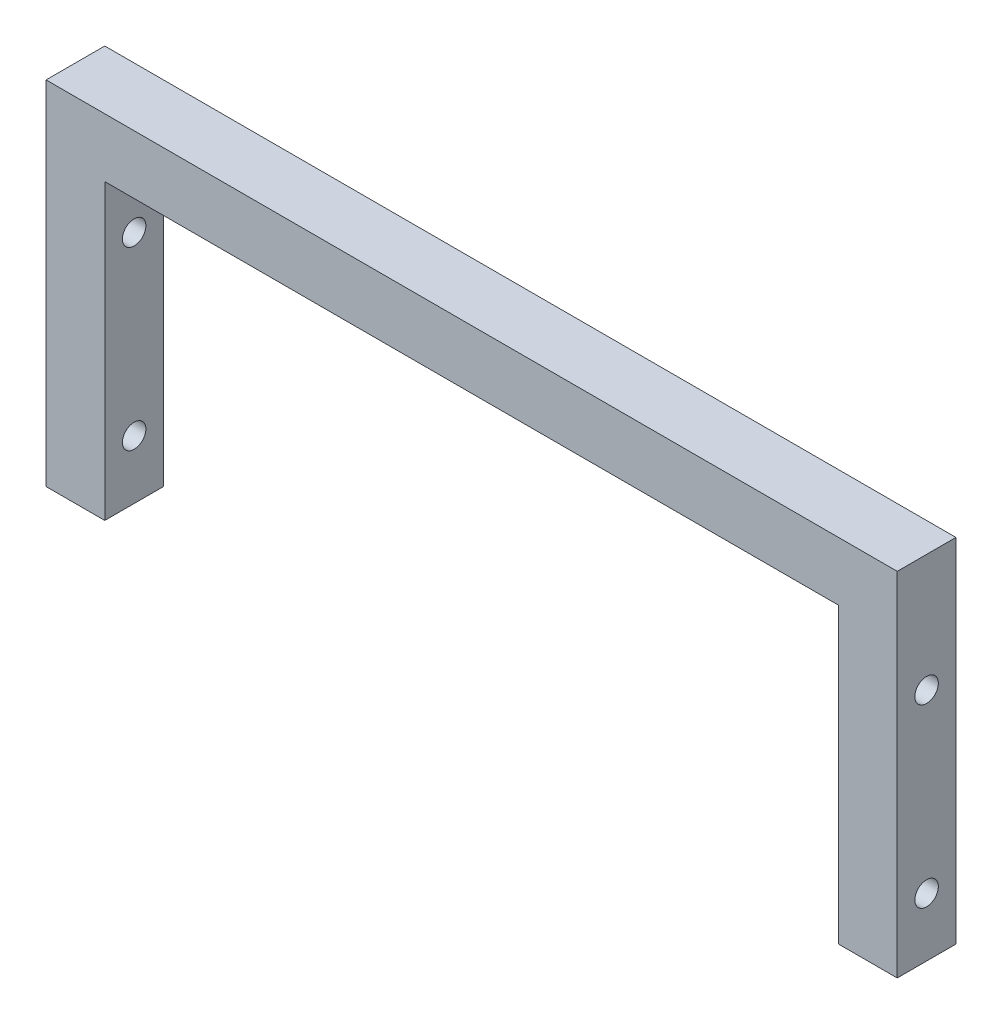
ISO-10303-21;
HEADER;
FILE_DESCRIPTION(('STEP AP214'),'2;1');
FILE_NAME('part.step','',(''),(''),'','','');
FILE_SCHEMA(('AUTOMOTIVE_DESIGN { 1 0 10303 214 1 1 1 1 }'));
ENDSEC;
DATA;
#1=APPLICATION_CONTEXT('core data for automotive mechanical design processes');
#2=APPLICATION_PROTOCOL_DEFINITION('international standard','automotive_design',2000,#1);
#3=PRODUCT_CONTEXT('',#1,'mechanical');
#4=PRODUCT('Part','Part','',(#3));
#5=PRODUCT_RELATED_PRODUCT_CATEGORY('part','',(#4));
#6=PRODUCT_DEFINITION_FORMATION('','',#4);
#7=PRODUCT_DEFINITION_CONTEXT('part definition',#1,'design');
#8=PRODUCT_DEFINITION('design','',#6,#7);
#9=PRODUCT_DEFINITION_SHAPE('','',#8);
#10=(LENGTH_UNIT() NAMED_UNIT(*) SI_UNIT(.MILLI.,.METRE.));
#11=(NAMED_UNIT(*) PLANE_ANGLE_UNIT() SI_UNIT($,.RADIAN.));
#12=(NAMED_UNIT(*) SI_UNIT($,.STERADIAN.) SOLID_ANGLE_UNIT());
#13=UNCERTAINTY_MEASURE_WITH_UNIT(LENGTH_MEASURE(1.E-05),#10,'distance_accuracy_value','');
#14=(GEOMETRIC_REPRESENTATION_CONTEXT(3) GLOBAL_UNCERTAINTY_ASSIGNED_CONTEXT((#13)) GLOBAL_UNIT_ASSIGNED_CONTEXT((#10,
#11,#12)) REPRESENTATION_CONTEXT('',''));
#15=CARTESIAN_POINT('',(0.,0.,0.));
#16=DIRECTION('',(0.,0.,1.));
#17=DIRECTION('',(1.,0.,0.));
#18=AXIS2_PLACEMENT_3D('',#15,#16,#17);
#19=CARTESIAN_POINT('',(10.,0.,10.));
#20=DIRECTION('',(0.,1.,0.));
#21=DIRECTION('',(-1.,0.,0.));
#22=AXIS2_PLACEMENT_3D('',#19,#20,#21);
#23=PLANE('',#22);
#24=DIRECTION('',(1.,0.,0.));
#25=VECTOR('',#24,1.);
#26=CARTESIAN_POINT('',(10.,0.,0.));
#27=LINE('',#26,#25);
#28=CARTESIAN_POINT('',(0.,0.,0.));
#29=VERTEX_POINT('',#28);
#30=CARTESIAN_POINT('',(10.,0.,0.));
#31=VERTEX_POINT('',#30);
#32=EDGE_CURVE('E133',#29,#31,#27,.T.);
#33=ORIENTED_EDGE('',*,*,#32,.T.);
#34=DIRECTION('',(0.,0.,-1.));
#35=VECTOR('',#34,1.);
#36=CARTESIAN_POINT('',(10.,0.,10.));
#37=LINE('',#36,#35);
#38=CARTESIAN_POINT('',(10.,0.,10.));
#39=VERTEX_POINT('',#38);
#40=EDGE_CURVE('E11',#39,#31,#37,.T.);
#41=ORIENTED_EDGE('',*,*,#40,.F.);
#42=DIRECTION('',(1.,0.,0.));
#43=VECTOR('',#42,1.);
#44=CARTESIAN_POINT('',(10.,0.,10.));
#45=LINE('',#44,#43);
#46=CARTESIAN_POINT('',(0.,0.,10.));
#47=VERTEX_POINT('',#46);
#48=EDGE_CURVE('E148',#47,#39,#45,.T.);
#49=ORIENTED_EDGE('',*,*,#48,.F.);
#50=DIRECTION('',(0.,0.,-1.));
#51=VECTOR('',#50,1.);
#52=CARTESIAN_POINT('',(0.,0.,10.));
#53=LINE('',#52,#51);
#54=EDGE_CURVE('E129',#47,#29,#53,.T.);
#55=ORIENTED_EDGE('',*,*,#54,.T.);
#56=EDGE_LOOP('',(#33,#41,#49,#55));
#57=FACE_BOUND('',#56,.T.);
#58=ADVANCED_FACE('F37',(#57),#23,.F.);
#59=CARTESIAN_POINT('',(10.,50.,10.));
#60=DIRECTION('',(-1.,0.,0.));
#61=DIRECTION('',(0.,-1.,0.));
#62=AXIS2_PLACEMENT_3D('',#59,#60,#61);
#63=PLANE('',#62);
#64=CARTESIAN_POINT('',(10.,10.,5.));
#65=DIRECTION('',(-1.,0.,0.));
#66=DIRECTION('',(0.,-1.,0.));
#67=AXIS2_PLACEMENT_3D('',#64,#65,#66);
#68=CIRCLE('',#67,2.);
#69=CARTESIAN_POINT('',(10.,8.,5.));
#70=VERTEX_POINT('',#69);
#71=EDGE_CURVE('E137',#70,#70,#68,.T.);
#72=ORIENTED_EDGE('',*,*,#71,.T.);
#73=EDGE_LOOP('',(#72));
#74=FACE_BOUND('',#73,.T.);
#75=CARTESIAN_POINT('',(10.,40.,5.));
#76=DIRECTION('',(-1.,0.,0.));
#77=DIRECTION('',(0.,-1.,0.));
#78=AXIS2_PLACEMENT_3D('',#75,#76,#77);
#79=CIRCLE('',#78,2.);
#80=CARTESIAN_POINT('',(10.,38.,5.));
#81=VERTEX_POINT('',#80);
#82=EDGE_CURVE('E189',#81,#81,#79,.T.);
#83=ORIENTED_EDGE('',*,*,#82,.T.);
#84=EDGE_LOOP('',(#83));
#85=FACE_BOUND('',#84,.T.);
#86=DIRECTION('',(0.,1.,0.));
#87=VECTOR('',#86,1.);
#88=CARTESIAN_POINT('',(10.,50.,0.));
#89=LINE('',#88,#87);
#90=CARTESIAN_POINT('',(10.,50.,0.));
#91=VERTEX_POINT('',#90);
#92=EDGE_CURVE('E136',#31,#91,#89,.T.);
#93=ORIENTED_EDGE('',*,*,#92,.T.);
#94=DIRECTION('',(0.,0.,-1.));
#95=VECTOR('',#94,1.);
#96=CARTESIAN_POINT('',(10.,50.,10.));
#97=LINE('',#96,#95);
#98=CARTESIAN_POINT('',(10.,50.,10.));
#99=VERTEX_POINT('',#98);
#100=EDGE_CURVE('E45',#99,#91,#97,.T.);
#101=ORIENTED_EDGE('',*,*,#100,.F.);
#102=DIRECTION('',(0.,1.,0.));
#103=VECTOR('',#102,1.);
#104=CARTESIAN_POINT('',(10.,50.,10.));
#105=LINE('',#104,#103);
#106=EDGE_CURVE('E96',#39,#99,#105,.T.);
#107=ORIENTED_EDGE('',*,*,#106,.F.);
#108=ORIENTED_EDGE('',*,*,#40,.T.);
#109=EDGE_LOOP('',(#93,#101,#107,#108));
#110=FACE_BOUND('',#109,.T.);
#111=ADVANCED_FACE('F217',(#74,#85,#110),#63,.F.);
#112=CARTESIAN_POINT('',(135.,50.,10.));
#113=DIRECTION('',(0.,1.,0.));
#114=DIRECTION('',(-1.,0.,0.));
#115=AXIS2_PLACEMENT_3D('',#112,#113,#114);
#116=PLANE('',#115);
#117=DIRECTION('',(1.,0.,0.));
#118=VECTOR('',#117,1.);
#119=CARTESIAN_POINT('',(135.,50.,0.));
#120=LINE('',#119,#118);
#121=CARTESIAN_POINT('',(135.,50.,0.));
#122=VERTEX_POINT('',#121);
#123=EDGE_CURVE('E139',#91,#122,#120,.T.);
#124=ORIENTED_EDGE('',*,*,#123,.T.);
#125=DIRECTION('',(0.,0.,-1.));
#126=VECTOR('',#125,1.);
#127=CARTESIAN_POINT('',(135.,50.,10.));
#128=LINE('',#127,#126);
#129=CARTESIAN_POINT('',(135.,50.,10.));
#130=VERTEX_POINT('',#129);
#131=EDGE_CURVE('E155',#130,#122,#128,.T.);
#132=ORIENTED_EDGE('',*,*,#131,.F.);
#133=DIRECTION('',(1.,0.,0.));
#134=VECTOR('',#133,1.);
#135=CARTESIAN_POINT('',(135.,50.,10.));
#136=LINE('',#135,#134);
#137=EDGE_CURVE('E163',#99,#130,#136,.T.);
#138=ORIENTED_EDGE('',*,*,#137,.F.);
#139=ORIENTED_EDGE('',*,*,#100,.T.);
#140=EDGE_LOOP('',(#124,#132,#138,#139));
#141=FACE_BOUND('',#140,.T.);
#142=ADVANCED_FACE('F161',(#141),#116,.F.);
#143=CARTESIAN_POINT('',(135.,0.,10.));
#144=DIRECTION('',(1.,0.,0.));
#145=DIRECTION('',(0.,0.,-1.));
#146=AXIS2_PLACEMENT_3D('',#143,#144,#145);
#147=PLANE('',#146);
#148=CARTESIAN_POINT('',(135.,10.,5.));
#149=DIRECTION('',(1.,0.,0.));
#150=DIRECTION('',(0.,0.,-1.));
#151=AXIS2_PLACEMENT_3D('',#148,#149,#150);
#152=CIRCLE('',#151,2.);
#153=CARTESIAN_POINT('',(135.,10.,3.));
#154=VERTEX_POINT('',#153);
#155=EDGE_CURVE('E183',#154,#154,#152,.T.);
#156=ORIENTED_EDGE('',*,*,#155,.T.);
#157=EDGE_LOOP('',(#156));
#158=FACE_BOUND('',#157,.T.);
#159=CARTESIAN_POINT('',(135.,40.,5.));
#160=DIRECTION('',(1.,0.,0.));
#161=DIRECTION('',(0.,0.,-1.));
#162=AXIS2_PLACEMENT_3D('',#159,#160,#161);
#163=CIRCLE('',#162,2.);
#164=CARTESIAN_POINT('',(135.,40.,3.));
#165=VERTEX_POINT('',#164);
#166=EDGE_CURVE('E192',#165,#165,#163,.T.);
#167=ORIENTED_EDGE('',*,*,#166,.T.);
#168=EDGE_LOOP('',(#167));
#169=FACE_BOUND('',#168,.T.);
#170=DIRECTION('',(0.,-1.,0.));
#171=VECTOR('',#170,1.);
#172=CARTESIAN_POINT('',(135.,0.,0.));
#173=LINE('',#172,#171);
#174=CARTESIAN_POINT('',(135.,0.,0.));
#175=VERTEX_POINT('',#174);
#176=EDGE_CURVE('E141',#122,#175,#173,.T.);
#177=ORIENTED_EDGE('',*,*,#176,.T.);
#178=DIRECTION('',(0.,0.,-1.));
#179=VECTOR('',#178,1.);
#180=CARTESIAN_POINT('',(135.,0.,10.));
#181=LINE('',#180,#179);
#182=CARTESIAN_POINT('',(135.,0.,10.));
#183=VERTEX_POINT('',#182);
#184=EDGE_CURVE('E152',#183,#175,#181,.T.);
#185=ORIENTED_EDGE('',*,*,#184,.F.);
#186=DIRECTION('',(0.,-1.,0.));
#187=VECTOR('',#186,1.);
#188=CARTESIAN_POINT('',(135.,0.,10.));
#189=LINE('',#188,#187);
#190=EDGE_CURVE('E175',#130,#183,#189,.T.);
#191=ORIENTED_EDGE('',*,*,#190,.F.);
#192=ORIENTED_EDGE('',*,*,#131,.T.);
#193=EDGE_LOOP('',(#177,#185,#191,#192));
#194=FACE_BOUND('',#193,.T.);
#195=ADVANCED_FACE('F171',(#158,#169,#194),#147,.F.);
#196=CARTESIAN_POINT('',(145.,0.,10.));
#197=DIRECTION('',(0.,1.,0.));
#198=DIRECTION('',(-1.,0.,0.));
#199=AXIS2_PLACEMENT_3D('',#196,#197,#198);
#200=PLANE('',#199);
#201=DIRECTION('',(1.,0.,0.));
#202=VECTOR('',#201,1.);
#203=CARTESIAN_POINT('',(145.,0.,0.));
#204=LINE('',#203,#202);
#205=CARTESIAN_POINT('',(145.,0.,0.));
#206=VERTEX_POINT('',#205);
#207=EDGE_CURVE('E143',#175,#206,#204,.T.);
#208=ORIENTED_EDGE('',*,*,#207,.T.);
#209=DIRECTION('',(0.,0.,-1.));
#210=VECTOR('',#209,1.);
#211=CARTESIAN_POINT('',(145.,0.,10.));
#212=LINE('',#211,#210);
#213=CARTESIAN_POINT('',(145.,0.,10.));
#214=VERTEX_POINT('',#213);
#215=EDGE_CURVE('E124',#214,#206,#212,.T.);
#216=ORIENTED_EDGE('',*,*,#215,.F.);
#217=DIRECTION('',(1.,0.,0.));
#218=VECTOR('',#217,1.);
#219=CARTESIAN_POINT('',(145.,0.,10.));
#220=LINE('',#219,#218);
#221=EDGE_CURVE('E115',#183,#214,#220,.T.);
#222=ORIENTED_EDGE('',*,*,#221,.F.);
#223=ORIENTED_EDGE('',*,*,#184,.T.);
#224=EDGE_LOOP('',(#208,#216,#222,#223));
#225=FACE_BOUND('',#224,.T.);
#226=ADVANCED_FACE('F174',(#225),#200,.F.);
#227=CARTESIAN_POINT('',(145.,60.,10.));
#228=DIRECTION('',(-1.,0.,0.));
#229=DIRECTION('',(0.,0.,1.));
#230=AXIS2_PLACEMENT_3D('',#227,#228,#229);
#231=PLANE('',#230);
#232=CARTESIAN_POINT('',(145.,10.,5.));
#233=DIRECTION('',(-1.,0.,0.));
#234=DIRECTION('',(0.,0.,1.));
#235=AXIS2_PLACEMENT_3D('',#232,#233,#234);
#236=CIRCLE('',#235,2.);
#237=CARTESIAN_POINT('',(145.,10.,7.));
#238=VERTEX_POINT('',#237);
#239=EDGE_CURVE('E186',#238,#238,#236,.T.);
#240=ORIENTED_EDGE('',*,*,#239,.T.);
#241=EDGE_LOOP('',(#240));
#242=FACE_BOUND('',#241,.T.);
#243=CARTESIAN_POINT('',(145.,40.,5.));
#244=DIRECTION('',(-1.,0.,0.));
#245=DIRECTION('',(0.,0.,1.));
#246=AXIS2_PLACEMENT_3D('',#243,#244,#245);
#247=CIRCLE('',#246,2.);
#248=CARTESIAN_POINT('',(145.,40.,7.));
#249=VERTEX_POINT('',#248);
#250=EDGE_CURVE('E195',#249,#249,#247,.T.);
#251=ORIENTED_EDGE('',*,*,#250,.T.);
#252=EDGE_LOOP('',(#251));
#253=FACE_BOUND('',#252,.T.);
#254=DIRECTION('',(0.,1.,0.));
#255=VECTOR('',#254,1.);
#256=CARTESIAN_POINT('',(145.,60.,0.));
#257=LINE('',#256,#255);
#258=CARTESIAN_POINT('',(145.,60.,0.));
#259=VERTEX_POINT('',#258);
#260=EDGE_CURVE('E123',#206,#259,#257,.T.);
#261=ORIENTED_EDGE('',*,*,#260,.T.);
#262=DIRECTION('',(0.,0.,-1.));
#263=VECTOR('',#262,1.);
#264=CARTESIAN_POINT('',(145.,60.,10.));
#265=LINE('',#264,#263);
#266=CARTESIAN_POINT('',(145.,60.,10.));
#267=VERTEX_POINT('',#266);
#268=EDGE_CURVE('E120',#267,#259,#265,.T.);
#269=ORIENTED_EDGE('',*,*,#268,.F.);
#270=DIRECTION('',(0.,1.,0.));
#271=VECTOR('',#270,1.);
#272=CARTESIAN_POINT('',(145.,60.,10.));
#273=LINE('',#272,#271);
#274=EDGE_CURVE('E109',#214,#267,#273,.T.);
#275=ORIENTED_EDGE('',*,*,#274,.F.);
#276=ORIENTED_EDGE('',*,*,#215,.T.);
#277=EDGE_LOOP('',(#261,#269,#275,#276));
#278=FACE_BOUND('',#277,.T.);
#279=ADVANCED_FACE('F121',(#242,#253,#278),#231,.F.);
#280=CARTESIAN_POINT('',(0.,60.,10.));
#281=DIRECTION('',(0.,-1.,0.));
#282=DIRECTION('',(0.,0.,-1.));
#283=AXIS2_PLACEMENT_3D('',#280,#281,#282);
#284=PLANE('',#283);
#285=DIRECTION('',(-1.,0.,0.));
#286=VECTOR('',#285,1.);
#287=CARTESIAN_POINT('',(0.,60.,0.));
#288=LINE('',#287,#286);
#289=CARTESIAN_POINT('',(0.,60.,0.));
#290=VERTEX_POINT('',#289);
#291=EDGE_CURVE('E82',#259,#290,#288,.T.);
#292=ORIENTED_EDGE('',*,*,#291,.T.);
#293=DIRECTION('',(0.,0.,-1.));
#294=VECTOR('',#293,1.);
#295=CARTESIAN_POINT('',(0.,60.,10.));
#296=LINE('',#295,#294);
#297=CARTESIAN_POINT('',(0.,60.,10.));
#298=VERTEX_POINT('',#297);
#299=EDGE_CURVE('E125',#298,#290,#296,.T.);
#300=ORIENTED_EDGE('',*,*,#299,.F.);
#301=DIRECTION('',(-1.,0.,0.));
#302=VECTOR('',#301,1.);
#303=CARTESIAN_POINT('',(0.,60.,10.));
#304=LINE('',#303,#302);
#305=EDGE_CURVE('E113',#267,#298,#304,.T.);
#306=ORIENTED_EDGE('',*,*,#305,.F.);
#307=ORIENTED_EDGE('',*,*,#268,.T.);
#308=EDGE_LOOP('',(#292,#300,#306,#307));
#309=FACE_BOUND('',#308,.T.);
#310=ADVANCED_FACE('F127',(#309),#284,.F.);
#311=CARTESIAN_POINT('',(0.,0.,10.));
#312=DIRECTION('',(1.,0.,0.));
#313=DIRECTION('',(0.,0.,-1.));
#314=AXIS2_PLACEMENT_3D('',#311,#312,#313);
#315=PLANE('',#314);
#316=CARTESIAN_POINT('',(0.,10.,5.));
#317=DIRECTION('',(1.,0.,0.));
#318=DIRECTION('',(0.,0.,-1.));
#319=AXIS2_PLACEMENT_3D('',#316,#317,#318);
#320=CIRCLE('',#319,2.);
#321=CARTESIAN_POINT('',(0.,10.,3.));
#322=VERTEX_POINT('',#321);
#323=EDGE_CURVE('E198',#322,#322,#320,.T.);
#324=ORIENTED_EDGE('',*,*,#323,.T.);
#325=EDGE_LOOP('',(#324));
#326=FACE_BOUND('',#325,.T.);
#327=CARTESIAN_POINT('',(0.,40.,5.));
#328=DIRECTION('',(1.,0.,0.));
#329=DIRECTION('',(0.,0.,-1.));
#330=AXIS2_PLACEMENT_3D('',#327,#328,#329);
#331=CIRCLE('',#330,2.);
#332=CARTESIAN_POINT('',(0.,40.,3.));
#333=VERTEX_POINT('',#332);
#334=EDGE_CURVE('E199',#333,#333,#331,.T.);
#335=ORIENTED_EDGE('',*,*,#334,.T.);
#336=EDGE_LOOP('',(#335));
#337=FACE_BOUND('',#336,.T.);
#338=DIRECTION('',(0.,-1.,0.));
#339=VECTOR('',#338,1.);
#340=CARTESIAN_POINT('',(0.,0.,0.));
#341=LINE('',#340,#339);
#342=EDGE_CURVE('E88',#290,#29,#341,.T.);
#343=ORIENTED_EDGE('',*,*,#342,.T.);
#344=ORIENTED_EDGE('',*,*,#54,.F.);
#345=DIRECTION('',(0.,-1.,0.));
#346=VECTOR('',#345,1.);
#347=CARTESIAN_POINT('',(0.,0.,10.));
#348=LINE('',#347,#346);
#349=EDGE_CURVE('E53',#298,#47,#348,.T.);
#350=ORIENTED_EDGE('',*,*,#349,.F.);
#351=ORIENTED_EDGE('',*,*,#299,.T.);
#352=EDGE_LOOP('',(#343,#344,#350,#351));
#353=FACE_BOUND('',#352,.T.);
#354=ADVANCED_FACE('F205',(#326,#337,#353),#315,.F.);
#355=CARTESIAN_POINT('',(0.,0.,10.));
#356=DIRECTION('',(0.,0.,-1.));
#357=DIRECTION('',(-1.,0.,0.));
#358=AXIS2_PLACEMENT_3D('',#355,#356,#357);
#359=PLANE('',#358);
#360=ORIENTED_EDGE('',*,*,#48,.T.);
#361=ORIENTED_EDGE('',*,*,#106,.T.);
#362=ORIENTED_EDGE('',*,*,#137,.T.);
#363=ORIENTED_EDGE('',*,*,#190,.T.);
#364=ORIENTED_EDGE('',*,*,#221,.T.);
#365=ORIENTED_EDGE('',*,*,#274,.T.);
#366=ORIENTED_EDGE('',*,*,#305,.T.);
#367=ORIENTED_EDGE('',*,*,#349,.T.);
#368=EDGE_LOOP('',(#360,#361,#362,#363,#364,#365,#366,#367));
#369=FACE_BOUND('',#368,.T.);
#370=ADVANCED_FACE('F111',(#369),#359,.F.);
#371=CARTESIAN_POINT('',(0.,0.,0.));
#372=DIRECTION('',(0.,0.,-1.));
#373=DIRECTION('',(-1.,0.,0.));
#374=AXIS2_PLACEMENT_3D('',#371,#372,#373);
#375=PLANE('',#374);
#376=ORIENTED_EDGE('',*,*,#32,.F.);
#377=ORIENTED_EDGE('',*,*,#342,.F.);
#378=ORIENTED_EDGE('',*,*,#291,.F.);
#379=ORIENTED_EDGE('',*,*,#260,.F.);
#380=ORIENTED_EDGE('',*,*,#207,.F.);
#381=ORIENTED_EDGE('',*,*,#176,.F.);
#382=ORIENTED_EDGE('',*,*,#123,.F.);
#383=ORIENTED_EDGE('',*,*,#92,.F.);
#384=EDGE_LOOP('',(#376,#377,#378,#379,#380,#381,#382,#383));
#385=FACE_BOUND('',#384,.T.);
#386=ADVANCED_FACE('F167',(#385),#375,.T.);
#387=CARTESIAN_POINT('',(0.,40.,5.));
#388=DIRECTION('',(1.,0.,0.));
#389=DIRECTION('',(0.,0.,-1.));
#390=AXIS2_PLACEMENT_3D('',#387,#388,#389);
#391=CYLINDRICAL_SURFACE('',#390,2.);
#392=ORIENTED_EDGE('',*,*,#334,.F.);
#393=EDGE_LOOP('',(#392));
#394=FACE_BOUND('',#393,.T.);
#395=ORIENTED_EDGE('',*,*,#82,.F.);
#396=EDGE_LOOP('',(#395));
#397=FACE_BOUND('',#396,.T.);
#398=ADVANCED_FACE('F212',(#394,#397),#391,.F.);
#399=CARTESIAN_POINT('',(0.,10.,5.));
#400=DIRECTION('',(1.,0.,0.));
#401=DIRECTION('',(0.,0.,-1.));
#402=AXIS2_PLACEMENT_3D('',#399,#400,#401);
#403=CYLINDRICAL_SURFACE('',#402,2.);
#404=ORIENTED_EDGE('',*,*,#323,.F.);
#405=EDGE_LOOP('',(#404));
#406=FACE_BOUND('',#405,.T.);
#407=ORIENTED_EDGE('',*,*,#71,.F.);
#408=EDGE_LOOP('',(#407));
#409=FACE_BOUND('',#408,.T.);
#410=ADVANCED_FACE('F208',(#406,#409),#403,.F.);
#411=ORIENTED_EDGE('',*,*,#250,.F.);
#412=EDGE_LOOP('',(#411));
#413=FACE_BOUND('',#412,.T.);
#414=ORIENTED_EDGE('',*,*,#166,.F.);
#415=EDGE_LOOP('',(#414));
#416=FACE_BOUND('',#415,.T.);
#417=ADVANCED_FACE('F211',(#413,#416),#391,.F.);
#418=ORIENTED_EDGE('',*,*,#239,.F.);
#419=EDGE_LOOP('',(#418));
#420=FACE_BOUND('',#419,.T.);
#421=ORIENTED_EDGE('',*,*,#155,.F.);
#422=EDGE_LOOP('',(#421));
#423=FACE_BOUND('',#422,.T.);
#424=ADVANCED_FACE('F214',(#420,#423),#403,.F.);
#425=CLOSED_SHELL('',(#58,#111,#142,#195,#226,#279,#310,#354,#370,#386,#398,#410,#417,#424));
#426=MANIFOLD_SOLID_BREP('B2',#425);
#427=ADVANCED_BREP_SHAPE_REPRESENTATION('',(#18,#426),#14);
#428=SHAPE_DEFINITION_REPRESENTATION(#9,#427);
ENDSEC;
END-ISO-10303-21;
